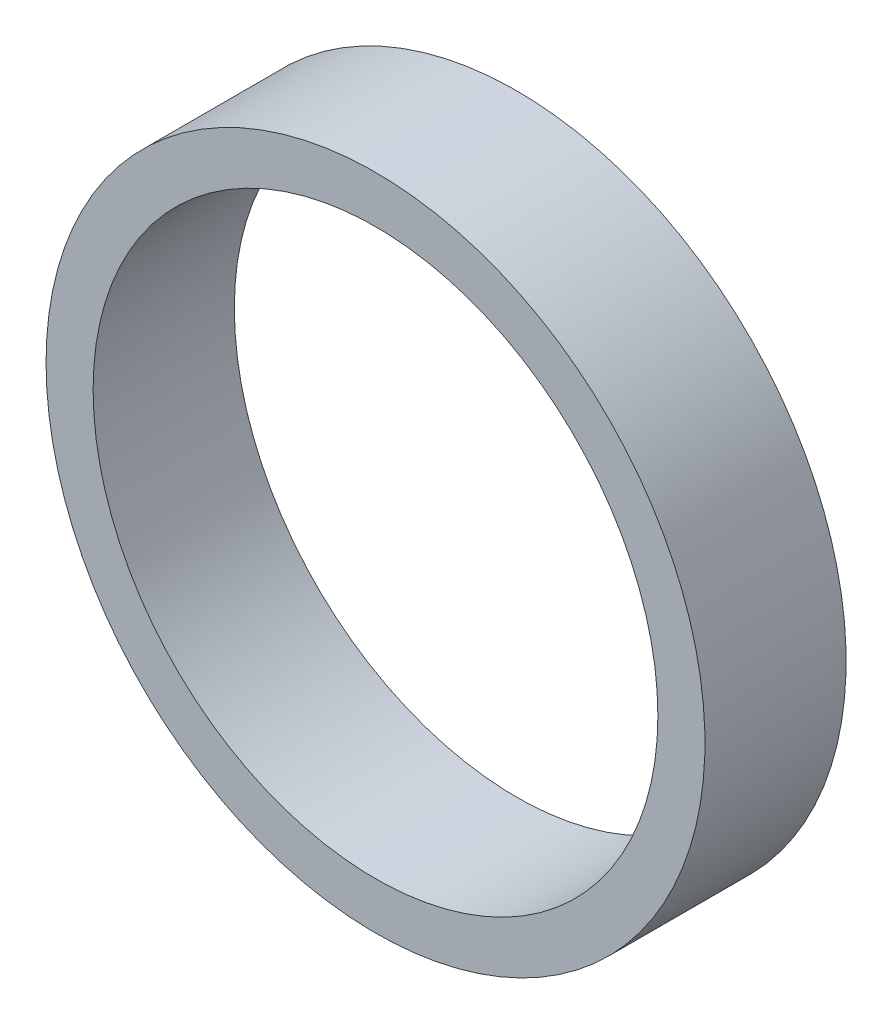
ISO-10303-21;
HEADER;
FILE_DESCRIPTION(('STEP AP214'),'2;1');
FILE_NAME('part.step','',(''),(''),'','','');
FILE_SCHEMA(('AUTOMOTIVE_DESIGN { 1 0 10303 214 1 1 1 1 }'));
ENDSEC;
DATA;
#1=APPLICATION_CONTEXT('core data for automotive mechanical design processes');
#2=APPLICATION_PROTOCOL_DEFINITION('international standard','automotive_design',2000,#1);
#3=PRODUCT_CONTEXT('',#1,'mechanical');
#4=PRODUCT('Part','Part','',(#3));
#5=PRODUCT_RELATED_PRODUCT_CATEGORY('part','',(#4));
#6=PRODUCT_DEFINITION_FORMATION('','',#4);
#7=PRODUCT_DEFINITION_CONTEXT('part definition',#1,'design');
#8=PRODUCT_DEFINITION('design','',#6,#7);
#9=PRODUCT_DEFINITION_SHAPE('','',#8);
#10=(LENGTH_UNIT() NAMED_UNIT(*) SI_UNIT(.MILLI.,.METRE.));
#11=(NAMED_UNIT(*) PLANE_ANGLE_UNIT() SI_UNIT($,.RADIAN.));
#12=(NAMED_UNIT(*) SI_UNIT($,.STERADIAN.) SOLID_ANGLE_UNIT());
#13=UNCERTAINTY_MEASURE_WITH_UNIT(LENGTH_MEASURE(1.E-05),#10,'distance_accuracy_value','');
#14=(GEOMETRIC_REPRESENTATION_CONTEXT(3) GLOBAL_UNCERTAINTY_ASSIGNED_CONTEXT((#13)) GLOBAL_UNIT_ASSIGNED_CONTEXT((#10,
#11,#12)) REPRESENTATION_CONTEXT('',''));
#15=CARTESIAN_POINT('',(0.,0.,0.));
#16=DIRECTION('',(0.,0.,1.));
#17=DIRECTION('',(1.,0.,0.));
#18=AXIS2_PLACEMENT_3D('',#15,#16,#17);
#19=CARTESIAN_POINT('',(0.,0.,9.525));
#20=DIRECTION('',(0.,0.,1.));
#21=DIRECTION('',(1.,0.,0.));
#22=AXIS2_PLACEMENT_3D('',#19,#20,#21);
#23=PLANE('',#22);
#24=CARTESIAN_POINT('',(0.,0.,9.525));
#25=DIRECTION('',(0.,0.,1.));
#26=DIRECTION('',(1.,0.,0.));
#27=AXIS2_PLACEMENT_3D('',#24,#25,#26);
#28=CIRCLE('',#27,22.225);
#29=CARTESIAN_POINT('',(-22.225,0.,9.525));
#30=VERTEX_POINT('',#29);
#31=EDGE_CURVE('E10',#30,#30,#28,.T.);
#32=ORIENTED_EDGE('',*,*,#31,.T.);
#33=EDGE_LOOP('',(#32));
#34=FACE_BOUND('',#33,.T.);
#35=CARTESIAN_POINT('',(0.,0.,9.525));
#36=DIRECTION('',(0.,0.,1.));
#37=DIRECTION('',(1.,0.,0.));
#38=AXIS2_PLACEMENT_3D('',#35,#36,#37);
#39=CIRCLE('',#38,19.05);
#40=CARTESIAN_POINT('',(-19.05,0.,9.525));
#41=VERTEX_POINT('',#40);
#42=EDGE_CURVE('E46',#41,#41,#39,.T.);
#43=ORIENTED_EDGE('',*,*,#42,.F.);
#44=EDGE_LOOP('',(#43));
#45=FACE_BOUND('',#44,.T.);
#46=ADVANCED_FACE('F34',(#34,#45),#23,.T.);
#47=CARTESIAN_POINT('',(0.,0.,0.));
#48=DIRECTION('',(0.,0.,1.));
#49=DIRECTION('',(1.,0.,0.));
#50=AXIS2_PLACEMENT_3D('',#47,#48,#49);
#51=PLANE('',#50);
#52=CARTESIAN_POINT('',(0.,0.,0.));
#53=DIRECTION('',(0.,0.,1.));
#54=DIRECTION('',(1.,0.,0.));
#55=AXIS2_PLACEMENT_3D('',#52,#53,#54);
#56=CIRCLE('',#55,22.225);
#57=CARTESIAN_POINT('',(-22.225,0.,0.));
#58=VERTEX_POINT('',#57);
#59=EDGE_CURVE('E38',#58,#58,#56,.T.);
#60=ORIENTED_EDGE('',*,*,#59,.F.);
#61=EDGE_LOOP('',(#60));
#62=FACE_BOUND('',#61,.T.);
#63=CARTESIAN_POINT('',(0.,0.,0.));
#64=DIRECTION('',(0.,0.,1.));
#65=DIRECTION('',(1.,0.,0.));
#66=AXIS2_PLACEMENT_3D('',#63,#64,#65);
#67=CIRCLE('',#66,19.05);
#68=CARTESIAN_POINT('',(-19.05,0.,0.));
#69=VERTEX_POINT('',#68);
#70=EDGE_CURVE('E48',#69,#69,#67,.T.);
#71=ORIENTED_EDGE('',*,*,#70,.T.);
#72=EDGE_LOOP('',(#71));
#73=FACE_BOUND('',#72,.T.);
#74=ADVANCED_FACE('F59',(#62,#73),#51,.F.);
#75=CARTESIAN_POINT('',(0.,0.,9.525));
#76=DIRECTION('',(0.,0.,-1.));
#77=DIRECTION('',(-1.,0.,0.));
#78=AXIS2_PLACEMENT_3D('',#75,#76,#77);
#79=CYLINDRICAL_SURFACE('',#78,22.225);
#80=CARTESIAN_POINT('',(-22.225,0.,9.525));
#81=CARTESIAN_POINT('',(-22.225,0.,9.42578125));
#82=CARTESIAN_POINT('',(-22.225,0.,9.3265625));
#83=CARTESIAN_POINT('',(-22.225,0.,9.128125));
#84=CARTESIAN_POINT('',(-22.225,0.,9.02890625));
#85=CARTESIAN_POINT('',(-22.225,0.,8.83046875));
#86=CARTESIAN_POINT('',(-22.225,0.,8.73125));
#87=CARTESIAN_POINT('',(-22.225,0.,8.5328125));
#88=CARTESIAN_POINT('',(-22.225,0.,8.43359375));
#89=CARTESIAN_POINT('',(-22.225,0.,8.23515625));
#90=CARTESIAN_POINT('',(-22.225,0.,8.1359375));
#91=CARTESIAN_POINT('',(-22.225,0.,7.9375));
#92=CARTESIAN_POINT('',(-22.225,0.,7.83828125));
#93=CARTESIAN_POINT('',(-22.225,0.,7.63984375));
#94=CARTESIAN_POINT('',(-22.225,0.,7.540625));
#95=CARTESIAN_POINT('',(-22.225,0.,7.3421875));
#96=CARTESIAN_POINT('',(-22.225,0.,7.24296875));
#97=CARTESIAN_POINT('',(-22.225,0.,7.04453125));
#98=CARTESIAN_POINT('',(-22.225,0.,6.9453125));
#99=CARTESIAN_POINT('',(-22.225,0.,6.746875));
#100=CARTESIAN_POINT('',(-22.225,0.,6.64765625));
#101=CARTESIAN_POINT('',(-22.225,0.,6.44921875));
#102=CARTESIAN_POINT('',(-22.225,0.,6.35));
#103=CARTESIAN_POINT('',(-22.225,0.,6.1515625));
#104=CARTESIAN_POINT('',(-22.225,0.,6.05234375));
#105=CARTESIAN_POINT('',(-22.225,0.,5.85390625));
#106=CARTESIAN_POINT('',(-22.225,0.,5.7546875));
#107=CARTESIAN_POINT('',(-22.225,0.,5.55625));
#108=CARTESIAN_POINT('',(-22.225,0.,5.45703125));
#109=CARTESIAN_POINT('',(-22.225,0.,5.25859375));
#110=CARTESIAN_POINT('',(-22.225,0.,5.159375));
#111=CARTESIAN_POINT('',(-22.225,0.,4.9609375));
#112=CARTESIAN_POINT('',(-22.225,0.,4.86171875));
#113=CARTESIAN_POINT('',(-22.225,0.,4.66328125));
#114=CARTESIAN_POINT('',(-22.225,0.,4.5640625));
#115=CARTESIAN_POINT('',(-22.225,0.,4.365625));
#116=CARTESIAN_POINT('',(-22.225,0.,4.26640625));
#117=CARTESIAN_POINT('',(-22.225,0.,4.06796875));
#118=CARTESIAN_POINT('',(-22.225,0.,3.96875));
#119=CARTESIAN_POINT('',(-22.225,0.,3.7703125));
#120=CARTESIAN_POINT('',(-22.225,0.,3.67109375));
#121=CARTESIAN_POINT('',(-22.225,0.,3.47265625));
#122=CARTESIAN_POINT('',(-22.225,0.,3.3734375));
#123=CARTESIAN_POINT('',(-22.225,0.,3.175));
#124=CARTESIAN_POINT('',(-22.225,0.,3.07578125));
#125=CARTESIAN_POINT('',(-22.225,0.,2.87734375));
#126=CARTESIAN_POINT('',(-22.225,0.,2.778125));
#127=CARTESIAN_POINT('',(-22.225,0.,2.5796875));
#128=CARTESIAN_POINT('',(-22.225,0.,2.48046875));
#129=CARTESIAN_POINT('',(-22.225,0.,2.28203125));
#130=CARTESIAN_POINT('',(-22.225,0.,2.1828125));
#131=CARTESIAN_POINT('',(-22.225,0.,1.984375));
#132=CARTESIAN_POINT('',(-22.225,0.,1.88515625));
#133=CARTESIAN_POINT('',(-22.225,0.,1.68671875));
#134=CARTESIAN_POINT('',(-22.225,0.,1.5875));
#135=CARTESIAN_POINT('',(-22.225,0.,1.3890625));
#136=CARTESIAN_POINT('',(-22.225,0.,1.28984375));
#137=CARTESIAN_POINT('',(-22.225,0.,1.09140625));
#138=CARTESIAN_POINT('',(-22.225,0.,0.992187500000001));
#139=CARTESIAN_POINT('',(-22.225,0.,0.793750000000001));
#140=CARTESIAN_POINT('',(-22.225,0.,0.69453125));
#141=CARTESIAN_POINT('',(-22.225,0.,0.49609375));
#142=CARTESIAN_POINT('',(-22.225,0.,0.396875));
#143=CARTESIAN_POINT('',(-22.225,0.,0.1984375));
#144=CARTESIAN_POINT('',(-22.225,0.,0.0992187500000001));
#145=CARTESIAN_POINT('',(-22.225,0.,0.));
#146=B_SPLINE_CURVE_WITH_KNOTS('',3,(#80,#81,#82,#83,#84,#85,#86,#87,#88,#89,#90,#91,#92,#93,
#94,#95,#96,#97,#98,#99,#100,#101,#102,#103,#104,#105,#106,#107,#108,#109,#110,#111,#112,#113,
#114,#115,#116,#117,#118,#119,#120,#121,#122,#123,#124,#125,#126,#127,#128,#129,#130,#131,#132,
#133,#134,#135,#136,#137,#138,#139,#140,#141,#142,#143,#144,#145),.UNSPECIFIED.,.F.,.F.,(4,2,2,
2,2,2,2,2,2,2,2,2,2,2,2,2,2,2,2,2,2,2,2,2,2,2,2,2,2,2,2,2,4),(0.,0.297656249999998,
0.595312499999999,0.892968749999999,1.190625,1.48828125,1.7859375,2.08359375,2.38125,2.67890625,
2.9765625,3.27421875,3.571875,3.86953125,4.1671875,4.46484375,4.7625,5.06015625,5.3578125,
5.65546875,5.953125,6.25078125,6.5484375,6.84609375,7.14375,7.44140625,7.7390625,8.03671875,
8.334375,8.63203125,8.9296875,9.22734375,9.525),.UNSPECIFIED.);
#147=EDGE_CURVE('BSEAM36',#30,#58,#146,.T.);
#148=ORIENTED_EDGE('',*,*,#31,.F.);
#149=ORIENTED_EDGE('',*,*,#59,.T.);
#150=ORIENTED_EDGE('',*,*,#147,.T.);
#151=ORIENTED_EDGE('',*,*,#147,.F.);
#152=EDGE_LOOP('',(#148,#150,#149,#151));
#153=FACE_BOUND('',#152,.T.);
#154=ADVANCED_FACE('F36',(#153),#79,.T.);
#155=CARTESIAN_POINT('',(0.,0.,9.525));
#156=DIRECTION('',(0.,0.,-1.));
#157=DIRECTION('',(-1.,0.,0.));
#158=AXIS2_PLACEMENT_3D('',#155,#156,#157);
#159=CYLINDRICAL_SURFACE('',#158,19.05);
#160=CARTESIAN_POINT('',(-19.05,0.,9.525));
#161=CARTESIAN_POINT('',(-19.05,0.,9.42578125));
#162=CARTESIAN_POINT('',(-19.05,0.,9.3265625));
#163=CARTESIAN_POINT('',(-19.05,0.,9.128125));
#164=CARTESIAN_POINT('',(-19.05,0.,9.02890625));
#165=CARTESIAN_POINT('',(-19.05,0.,8.83046875));
#166=CARTESIAN_POINT('',(-19.05,0.,8.73125));
#167=CARTESIAN_POINT('',(-19.05,0.,8.5328125));
#168=CARTESIAN_POINT('',(-19.05,0.,8.43359375));
#169=CARTESIAN_POINT('',(-19.05,0.,8.23515625));
#170=CARTESIAN_POINT('',(-19.05,0.,8.1359375));
#171=CARTESIAN_POINT('',(-19.05,0.,7.9375));
#172=CARTESIAN_POINT('',(-19.05,0.,7.83828125));
#173=CARTESIAN_POINT('',(-19.05,0.,7.63984375));
#174=CARTESIAN_POINT('',(-19.05,0.,7.540625));
#175=CARTESIAN_POINT('',(-19.05,0.,7.3421875));
#176=CARTESIAN_POINT('',(-19.05,0.,7.24296875));
#177=CARTESIAN_POINT('',(-19.05,0.,7.04453125));
#178=CARTESIAN_POINT('',(-19.05,0.,6.9453125));
#179=CARTESIAN_POINT('',(-19.05,0.,6.746875));
#180=CARTESIAN_POINT('',(-19.05,0.,6.64765625));
#181=CARTESIAN_POINT('',(-19.05,0.,6.44921875));
#182=CARTESIAN_POINT('',(-19.05,0.,6.35));
#183=CARTESIAN_POINT('',(-19.05,0.,6.1515625));
#184=CARTESIAN_POINT('',(-19.05,0.,6.05234375));
#185=CARTESIAN_POINT('',(-19.05,0.,5.85390625));
#186=CARTESIAN_POINT('',(-19.05,0.,5.7546875));
#187=CARTESIAN_POINT('',(-19.05,0.,5.55625));
#188=CARTESIAN_POINT('',(-19.05,0.,5.45703125));
#189=CARTESIAN_POINT('',(-19.05,0.,5.25859375));
#190=CARTESIAN_POINT('',(-19.05,0.,5.159375));
#191=CARTESIAN_POINT('',(-19.05,0.,4.9609375));
#192=CARTESIAN_POINT('',(-19.05,0.,4.86171875));
#193=CARTESIAN_POINT('',(-19.05,0.,4.66328125));
#194=CARTESIAN_POINT('',(-19.05,0.,4.5640625));
#195=CARTESIAN_POINT('',(-19.05,0.,4.365625));
#196=CARTESIAN_POINT('',(-19.05,0.,4.26640625));
#197=CARTESIAN_POINT('',(-19.05,0.,4.06796875));
#198=CARTESIAN_POINT('',(-19.05,0.,3.96875));
#199=CARTESIAN_POINT('',(-19.05,0.,3.7703125));
#200=CARTESIAN_POINT('',(-19.05,0.,3.67109375));
#201=CARTESIAN_POINT('',(-19.05,0.,3.47265625));
#202=CARTESIAN_POINT('',(-19.05,0.,3.3734375));
#203=CARTESIAN_POINT('',(-19.05,0.,3.175));
#204=CARTESIAN_POINT('',(-19.05,0.,3.07578125));
#205=CARTESIAN_POINT('',(-19.05,0.,2.87734375));
#206=CARTESIAN_POINT('',(-19.05,0.,2.778125));
#207=CARTESIAN_POINT('',(-19.05,0.,2.5796875));
#208=CARTESIAN_POINT('',(-19.05,0.,2.48046875));
#209=CARTESIAN_POINT('',(-19.05,0.,2.28203125));
#210=CARTESIAN_POINT('',(-19.05,0.,2.1828125));
#211=CARTESIAN_POINT('',(-19.05,0.,1.984375));
#212=CARTESIAN_POINT('',(-19.05,0.,1.88515625));
#213=CARTESIAN_POINT('',(-19.05,0.,1.68671875));
#214=CARTESIAN_POINT('',(-19.05,0.,1.5875));
#215=CARTESIAN_POINT('',(-19.05,0.,1.3890625));
#216=CARTESIAN_POINT('',(-19.05,0.,1.28984375));
#217=CARTESIAN_POINT('',(-19.05,0.,1.09140625));
#218=CARTESIAN_POINT('',(-19.05,0.,0.992187500000001));
#219=CARTESIAN_POINT('',(-19.05,0.,0.793750000000001));
#220=CARTESIAN_POINT('',(-19.05,0.,0.69453125));
#221=CARTESIAN_POINT('',(-19.05,0.,0.49609375));
#222=CARTESIAN_POINT('',(-19.05,0.,0.396875));
#223=CARTESIAN_POINT('',(-19.05,0.,0.1984375));
#224=CARTESIAN_POINT('',(-19.05,0.,0.0992187500000001));
#225=CARTESIAN_POINT('',(-19.05,0.,0.));
#226=B_SPLINE_CURVE_WITH_KNOTS('',3,(#160,#161,#162,#163,#164,#165,#166,#167,#168,#169,#170,
#171,#172,#173,#174,#175,#176,#177,#178,#179,#180,#181,#182,#183,#184,#185,#186,#187,#188,#189,
#190,#191,#192,#193,#194,#195,#196,#197,#198,#199,#200,#201,#202,#203,#204,#205,#206,#207,#208,
#209,#210,#211,#212,#213,#214,#215,#216,#217,#218,#219,#220,#221,#222,#223,#224,#225),
.UNSPECIFIED.,.F.,.F.,(4,2,2,2,2,2,2,2,2,2,2,2,2,2,2,2,2,2,2,2,2,2,2,2,2,2,2,2,2,2,2,2,4),(0.,
0.29765625,0.5953125,0.892968750000001,1.190625,1.48828125,1.7859375,2.08359375,2.38125,
2.67890625,2.9765625,3.27421875,3.571875,3.86953125,4.1671875,4.46484375,4.7625,5.06015625,
5.3578125,5.65546875,5.953125,6.25078125,6.5484375,6.84609375,7.14375,7.44140625,7.7390625,
8.03671875,8.334375,8.63203125,8.9296875,9.22734375,9.525),.UNSPECIFIED.);
#227=EDGE_CURVE('BSEAM55',#41,#69,#226,.T.);
#228=ORIENTED_EDGE('',*,*,#42,.T.);
#229=ORIENTED_EDGE('',*,*,#70,.F.);
#230=ORIENTED_EDGE('',*,*,#227,.T.);
#231=ORIENTED_EDGE('',*,*,#227,.F.);
#232=EDGE_LOOP('',(#228,#230,#229,#231));
#233=FACE_BOUND('',#232,.T.);
#234=ADVANCED_FACE('F55',(#233),#159,.F.);
#235=CLOSED_SHELL('',(#46,#74,#154,#234));
#236=MANIFOLD_SOLID_BREP('B2',#235);
#237=ADVANCED_BREP_SHAPE_REPRESENTATION('',(#18,#236),#14);
#238=SHAPE_DEFINITION_REPRESENTATION(#9,#237);
ENDSEC;
END-ISO-10303-21;
